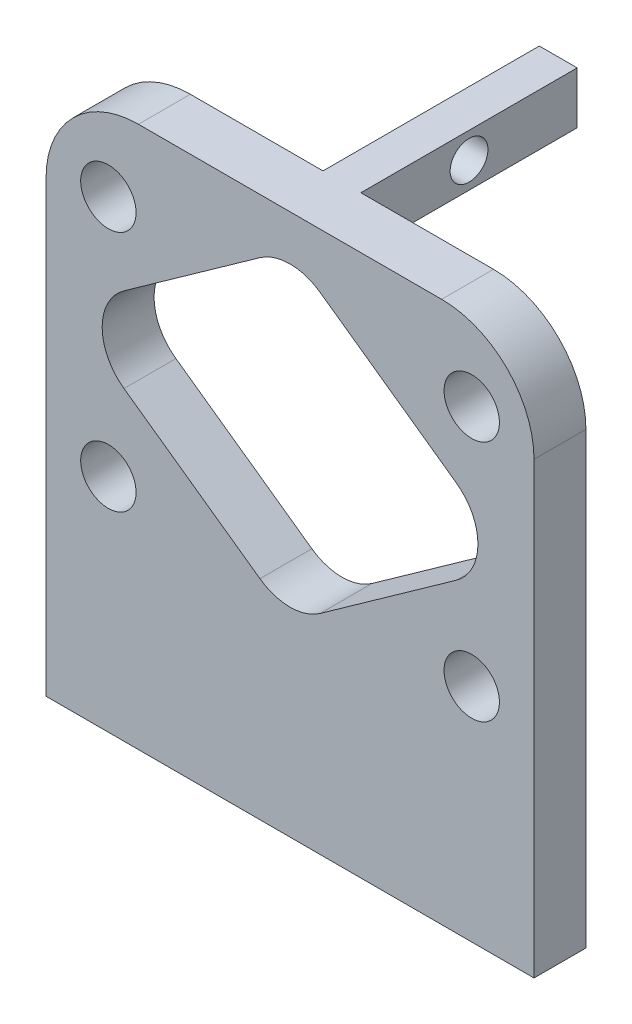
ISO-10303-21;
HEADER;
FILE_DESCRIPTION(('STEP AP214'),'2;1');
FILE_NAME('part.step','',(''),(''),'','','');
FILE_SCHEMA(('AUTOMOTIVE_DESIGN { 1 0 10303 214 1 1 1 1 }'));
ENDSEC;
DATA;
#1=APPLICATION_CONTEXT('core data for automotive mechanical design processes');
#2=APPLICATION_PROTOCOL_DEFINITION('international standard','automotive_design',2000,#1);
#3=PRODUCT_CONTEXT('',#1,'mechanical');
#4=PRODUCT('Part','Part','',(#3));
#5=PRODUCT_RELATED_PRODUCT_CATEGORY('part','',(#4));
#6=PRODUCT_DEFINITION_FORMATION('','',#4);
#7=PRODUCT_DEFINITION_CONTEXT('part definition',#1,'design');
#8=PRODUCT_DEFINITION('design','',#6,#7);
#9=PRODUCT_DEFINITION_SHAPE('','',#8);
#10=(LENGTH_UNIT() NAMED_UNIT(*) SI_UNIT(.MILLI.,.METRE.));
#11=(NAMED_UNIT(*) PLANE_ANGLE_UNIT() SI_UNIT($,.RADIAN.));
#12=(NAMED_UNIT(*) SI_UNIT($,.STERADIAN.) SOLID_ANGLE_UNIT());
#13=UNCERTAINTY_MEASURE_WITH_UNIT(LENGTH_MEASURE(1.E-05),#10,'distance_accuracy_value','');
#14=(GEOMETRIC_REPRESENTATION_CONTEXT(3) GLOBAL_UNCERTAINTY_ASSIGNED_CONTEXT((#13)) GLOBAL_UNIT_ASSIGNED_CONTEXT((#10,
#11,#12)) REPRESENTATION_CONTEXT('',''));
#15=CARTESIAN_POINT('',(0.,0.,0.));
#16=DIRECTION('',(0.,0.,1.));
#17=DIRECTION('',(1.,0.,0.));
#18=AXIS2_PLACEMENT_3D('',#15,#16,#17);
#19=CARTESIAN_POINT('',(14.9160662909024,29.9521916334879,3.));
#20=DIRECTION('',(0.,0.,-1.));
#21=DIRECTION('',(-1.,0.,0.));
#22=AXIS2_PLACEMENT_3D('',#19,#20,#21);
#23=PLANE('',#22);
#24=CARTESIAN_POINT('',(34.1768293529617,30.7930162356204,3.));
#25=DIRECTION('',(0.,0.,1.));
#26=DIRECTION('',(1.,0.,0.));
#27=AXIS2_PLACEMENT_3D('',#24,#25,#26);
#28=CIRCLE('',#27,1.6);
#29=CARTESIAN_POINT('',(35.7768293529617,30.7930162356204,3.));
#30=VERTEX_POINT('',#29);
#31=EDGE_CURVE('E284',#30,#30,#28,.T.);
#32=ORIENTED_EDGE('',*,*,#31,.F.);
#33=EDGE_LOOP('',(#32));
#34=FACE_BOUND('',#33,.T.);
#35=CARTESIAN_POINT('',(13.1768293529617,16.7930162356204,3.));
#36=DIRECTION('',(0.,0.,1.));
#37=DIRECTION('',(1.,0.,0.));
#38=AXIS2_PLACEMENT_3D('',#35,#36,#37);
#39=CIRCLE('',#38,1.6);
#40=CARTESIAN_POINT('',(14.7768293529617,16.7930162356204,3.));
#41=VERTEX_POINT('',#40);
#42=EDGE_CURVE('E291',#41,#41,#39,.T.);
#43=ORIENTED_EDGE('',*,*,#42,.F.);
#44=EDGE_LOOP('',(#43));
#45=FACE_BOUND('',#44,.T.);
#46=CARTESIAN_POINT('',(34.1768293529617,16.7930162356204,3.));
#47=DIRECTION('',(0.,0.,1.));
#48=DIRECTION('',(1.,0.,0.));
#49=AXIS2_PLACEMENT_3D('',#46,#47,#48);
#50=CIRCLE('',#49,1.6);
#51=CARTESIAN_POINT('',(35.7768293529617,16.7930162356204,3.));
#52=VERTEX_POINT('',#51);
#53=EDGE_CURVE('E278',#52,#52,#50,.T.);
#54=ORIENTED_EDGE('',*,*,#53,.F.);
#55=EDGE_LOOP('',(#54));
#56=FACE_BOUND('',#55,.T.);
#57=CARTESIAN_POINT('',(13.1768293529617,30.7930162356204,3.));
#58=DIRECTION('',(0.,0.,1.));
#59=DIRECTION('',(1.,0.,0.));
#60=AXIS2_PLACEMENT_3D('',#57,#58,#59);
#61=CIRCLE('',#60,1.6);
#62=CARTESIAN_POINT('',(14.7768293529617,30.7930162356204,3.));
#63=VERTEX_POINT('',#62);
#64=EDGE_CURVE('E287',#63,#63,#61,.T.);
#65=ORIENTED_EDGE('',*,*,#64,.F.);
#66=EDGE_LOOP('',(#65));
#67=FACE_BOUND('',#66,.T.);
#68=DIRECTION('',(0.,-1.,0.));
#69=VECTOR('',#68,1.);
#70=CARTESIAN_POINT('',(9.57682935296174,12.8914285714286,3.));
#71=LINE('',#70,#69);
#72=CARTESIAN_POINT('',(9.57682935296174,29.9521916334879,3.));
#73=VERTEX_POINT('',#72);
#74=CARTESIAN_POINT('',(9.57682935296175,3.99142857142858,3.));
#75=VERTEX_POINT('',#74);
#76=EDGE_CURVE('E364',#73,#75,#71,.T.);
#77=ORIENTED_EDGE('',*,*,#76,.T.);
#78=DIRECTION('',(-1.,0.,0.));
#79=VECTOR('',#78,1.);
#80=CARTESIAN_POINT('',(37.7768293529617,3.99142857142858,3.));
#81=LINE('',#80,#79);
#82=CARTESIAN_POINT('',(37.7768293529617,3.99142857142858,3.));
#83=VERTEX_POINT('',#82);
#84=EDGE_CURVE('E231',#83,#75,#81,.T.);
#85=ORIENTED_EDGE('',*,*,#84,.F.);
#86=DIRECTION('',(0.,1.,0.));
#87=VECTOR('',#86,1.);
#88=CARTESIAN_POINT('',(37.7768293529617,12.8914285714286,3.));
#89=LINE('',#88,#87);
#90=CARTESIAN_POINT('',(37.7768293529617,29.9521916334879,3.));
#91=VERTEX_POINT('',#90);
#92=EDGE_CURVE('E366',#83,#91,#89,.T.);
#93=ORIENTED_EDGE('',*,*,#92,.T.);
#94=CARTESIAN_POINT('',(32.4375924150211,29.9521916334879,3.));
#95=DIRECTION('',(0.,0.,1.));
#96=DIRECTION('',(-1.,0.,0.));
#97=AXIS2_PLACEMENT_3D('',#94,#95,#96);
#98=CIRCLE('',#97,5.33923693794064);
#99=CARTESIAN_POINT('',(32.4375924150211,35.2914285714286,3.));
#100=VERTEX_POINT('',#99);
#101=EDGE_CURVE('E369',#91,#100,#98,.T.);
#102=ORIENTED_EDGE('',*,*,#101,.T.);
#103=DIRECTION('',(-1.,0.,0.));
#104=VECTOR('',#103,1.);
#105=CARTESIAN_POINT('',(14.9160662909024,35.2914285714286,3.));
#106=LINE('',#105,#104);
#107=CARTESIAN_POINT('',(14.9160662909024,35.2914285714286,3.));
#108=VERTEX_POINT('',#107);
#109=EDGE_CURVE('E371',#100,#108,#106,.T.);
#110=ORIENTED_EDGE('',*,*,#109,.T.);
#111=CARTESIAN_POINT('',(14.9160662909024,29.9521916334879,3.));
#112=DIRECTION('',(0.,0.,1.));
#113=DIRECTION('',(-1.,0.,0.));
#114=AXIS2_PLACEMENT_3D('',#111,#112,#113);
#115=CIRCLE('',#114,5.33923693794064);
#116=EDGE_CURVE('E373',#108,#73,#115,.T.);
#117=ORIENTED_EDGE('',*,*,#116,.T.);
#118=EDGE_LOOP('',(#77,#85,#93,#102,#110,#117));
#119=FACE_BOUND('',#118,.T.);
#120=CARTESIAN_POINT('',(23.6768293529618,18.5023904015677,3.));
#121=DIRECTION('',(0.,0.,1.));
#122=DIRECTION('',(1.,0.,0.));
#123=AXIS2_PLACEMENT_3D('',#120,#121,#122);
#124=CIRCLE('',#123,3.);
#125=CARTESIAN_POINT('',(21.938160435116,16.0575938059145,3.));
#126=VERTEX_POINT('',#125);
#127=CARTESIAN_POINT('',(25.4154982708075,16.0575938059145,3.));
#128=VERTEX_POINT('',#127);
#129=EDGE_CURVE('E302',#126,#128,#124,.T.);
#130=ORIENTED_EDGE('',*,*,#129,.F.);
#131=DIRECTION('',(0.814932198551049,-0.579556305948571,0.));
#132=VECTOR('',#131,1.);
#133=CARTESIAN_POINT('',(14.0792395385592,21.6466319757754,3.));
#134=LINE('',#133,#132);
#135=CARTESIAN_POINT('',(14.0792395385592,21.6466319757754,3.));
#136=VERTEX_POINT('',#135);
#137=EDGE_CURVE('E318',#136,#126,#134,.T.);
#138=ORIENTED_EDGE('',*,*,#137,.F.);
#139=CARTESIAN_POINT('',(15.8179084564049,24.0914285714286,3.));
#140=DIRECTION('',(0.,0.,1.));
#141=DIRECTION('',(1.,0.,0.));
#142=AXIS2_PLACEMENT_3D('',#139,#140,#141);
#143=CIRCLE('',#142,3.);
#144=CARTESIAN_POINT('',(14.0792395385592,26.5362251670817,3.));
#145=VERTEX_POINT('',#144);
#146=EDGE_CURVE('E315',#145,#136,#143,.T.);
#147=ORIENTED_EDGE('',*,*,#146,.F.);
#148=DIRECTION('',(-0.814932198551049,-0.579556305948571,0.));
#149=VECTOR('',#148,1.);
#150=CARTESIAN_POINT('',(14.0792395385592,26.5362251670817,3.));
#151=LINE('',#150,#149);
#152=CARTESIAN_POINT('',(21.938160435116,32.1252633369427,3.));
#153=VERTEX_POINT('',#152);
#154=EDGE_CURVE('E313',#153,#145,#151,.T.);
#155=ORIENTED_EDGE('',*,*,#154,.F.);
#156=CARTESIAN_POINT('',(23.6768293529618,29.6804667412895,3.));
#157=DIRECTION('',(0.,0.,1.));
#158=DIRECTION('',(-1.,0.,0.));
#159=AXIS2_PLACEMENT_3D('',#156,#157,#158);
#160=CIRCLE('',#159,3.00000000000001);
#161=CARTESIAN_POINT('',(25.4154982708075,32.1252633369427,3.));
#162=VERTEX_POINT('',#161);
#163=EDGE_CURVE('E311',#162,#153,#160,.T.);
#164=ORIENTED_EDGE('',*,*,#163,.F.);
#165=DIRECTION('',(-0.814932198551049,0.579556305948571,0.));
#166=VECTOR('',#165,1.);
#167=CARTESIAN_POINT('',(25.4154982708075,32.1252633369427,3.));
#168=LINE('',#167,#166);
#169=CARTESIAN_POINT('',(33.2744191673643,26.5362251670817,3.));
#170=VERTEX_POINT('',#169);
#171=EDGE_CURVE('E309',#170,#162,#168,.T.);
#172=ORIENTED_EDGE('',*,*,#171,.F.);
#173=CARTESIAN_POINT('',(31.5357502495186,24.0914285714286,3.));
#174=DIRECTION('',(0.,0.,1.));
#175=DIRECTION('',(1.,0.,0.));
#176=AXIS2_PLACEMENT_3D('',#173,#174,#175);
#177=CIRCLE('',#176,3.);
#178=CARTESIAN_POINT('',(33.2744191673643,21.6466319757754,3.));
#179=VERTEX_POINT('',#178);
#180=EDGE_CURVE('E307',#179,#170,#177,.T.);
#181=ORIENTED_EDGE('',*,*,#180,.F.);
#182=DIRECTION('',(0.814932198551049,0.579556305948571,0.));
#183=VECTOR('',#182,1.);
#184=CARTESIAN_POINT('',(25.4154982708075,16.0575938059145,3.));
#185=LINE('',#184,#183);
#186=EDGE_CURVE('E304',#128,#179,#185,.T.);
#187=ORIENTED_EDGE('',*,*,#186,.F.);
#188=EDGE_LOOP('',(#130,#138,#147,#155,#164,#172,#181,#187));
#189=FACE_BOUND('',#188,.T.);
#190=ADVANCED_FACE('F41',(#34,#45,#56,#67,#119,#189),#23,.F.);
#191=CARTESIAN_POINT('',(14.9160662909024,29.9521916334879,0.));
#192=DIRECTION('',(0.,0.,-1.));
#193=DIRECTION('',(-1.,0.,0.));
#194=AXIS2_PLACEMENT_3D('',#191,#192,#193);
#195=PLANE('',#194);
#196=DIRECTION('',(0.,-1.,0.));
#197=VECTOR('',#196,1.);
#198=CARTESIAN_POINT('',(24.7712024696485,6.99142857142858,0.));
#199=LINE('',#198,#197);
#200=CARTESIAN_POINT('',(24.7712024696485,6.99142857142858,0.));
#201=VERTEX_POINT('',#200);
#202=CARTESIAN_POINT('',(24.7712024696485,3.99142857142858,0.));
#203=VERTEX_POINT('',#202);
#204=EDGE_CURVE('E58',#201,#203,#199,.T.);
#205=ORIENTED_EDGE('',*,*,#204,.F.);
#206=DIRECTION('',(1.,0.,0.));
#207=VECTOR('',#206,1.);
#208=CARTESIAN_POINT('',(9.72749610409256,6.99142857142858,0.));
#209=LINE('',#208,#207);
#210=CARTESIAN_POINT('',(22.582456236275,6.99142857142858,0.));
#211=VERTEX_POINT('',#210);
#212=EDGE_CURVE('E224',#211,#201,#209,.T.);
#213=ORIENTED_EDGE('',*,*,#212,.F.);
#214=DIRECTION('',(0.,1.,0.));
#215=VECTOR('',#214,1.);
#216=CARTESIAN_POINT('',(22.582456236275,6.99142857142858,0.));
#217=LINE('',#216,#215);
#218=CARTESIAN_POINT('',(22.582456236275,3.99142857142858,0.));
#219=VERTEX_POINT('',#218);
#220=EDGE_CURVE('E505',#219,#211,#217,.T.);
#221=ORIENTED_EDGE('',*,*,#220,.F.);
#222=DIRECTION('',(1.,0.,0.));
#223=VECTOR('',#222,1.);
#224=CARTESIAN_POINT('',(9.57682935296174,3.99142857142858,0.));
#225=LINE('',#224,#223);
#226=CARTESIAN_POINT('',(9.57682935296174,3.99142857142858,0.));
#227=VERTEX_POINT('',#226);
#228=EDGE_CURVE('E236',#227,#219,#225,.T.);
#229=ORIENTED_EDGE('',*,*,#228,.F.);
#230=DIRECTION('',(0.,-1.,0.));
#231=VECTOR('',#230,1.);
#232=CARTESIAN_POINT('',(9.57682935296174,12.8914285714286,0.));
#233=LINE('',#232,#231);
#234=CARTESIAN_POINT('',(9.57682935296174,29.9521916334879,0.));
#235=VERTEX_POINT('',#234);
#236=EDGE_CURVE('E363',#235,#227,#233,.T.);
#237=ORIENTED_EDGE('',*,*,#236,.F.);
#238=CARTESIAN_POINT('',(14.9160662909024,29.9521916334879,0.));
#239=DIRECTION('',(0.,0.,1.));
#240=DIRECTION('',(-1.,0.,0.));
#241=AXIS2_PLACEMENT_3D('',#238,#239,#240);
#242=CIRCLE('',#241,5.33923693794064);
#243=CARTESIAN_POINT('',(14.9160662909024,35.2914285714286,0.));
#244=VERTEX_POINT('',#243);
#245=EDGE_CURVE('E367',#244,#235,#242,.T.);
#246=ORIENTED_EDGE('',*,*,#245,.F.);
#247=DIRECTION('',(-1.,0.,0.));
#248=VECTOR('',#247,1.);
#249=CARTESIAN_POINT('',(14.9160662909024,35.2914285714286,0.));
#250=LINE('',#249,#248);
#251=CARTESIAN_POINT('',(22.582456236275,35.2914285714286,0.));
#252=VERTEX_POINT('',#251);
#253=EDGE_CURVE('E381',#252,#244,#250,.T.);
#254=ORIENTED_EDGE('',*,*,#253,.F.);
#255=DIRECTION('',(0.,1.,0.));
#256=VECTOR('',#255,1.);
#257=CARTESIAN_POINT('',(22.582456236275,32.2914285714286,0.));
#258=LINE('',#257,#256);
#259=CARTESIAN_POINT('',(22.582456236275,32.4737349850272,0.));
#260=VERTEX_POINT('',#259);
#261=EDGE_CURVE('E11',#260,#252,#258,.T.);
#262=ORIENTED_EDGE('',*,*,#261,.F.);
#263=CARTESIAN_POINT('',(23.6768293529618,29.6804667412895,0.));
#264=DIRECTION('',(0.,0.,1.));
#265=DIRECTION('',(-1.,0.,0.));
#266=AXIS2_PLACEMENT_3D('',#263,#264,#265);
#267=CIRCLE('',#266,3.00000000000001);
#268=CARTESIAN_POINT('',(21.938160435116,32.1252633369427,0.));
#269=VERTEX_POINT('',#268);
#270=EDGE_CURVE('E332',#260,#269,#267,.T.);
#271=ORIENTED_EDGE('',*,*,#270,.T.);
#272=DIRECTION('',(-0.814932198551049,-0.579556305948571,0.));
#273=VECTOR('',#272,1.);
#274=CARTESIAN_POINT('',(14.0792395385592,26.5362251670817,0.));
#275=LINE('',#274,#273);
#276=CARTESIAN_POINT('',(14.0792395385592,26.5362251670817,0.));
#277=VERTEX_POINT('',#276);
#278=EDGE_CURVE('E336',#269,#277,#275,.T.);
#279=ORIENTED_EDGE('',*,*,#278,.T.);
#280=CARTESIAN_POINT('',(15.8179084564049,24.0914285714286,0.));
#281=DIRECTION('',(0.,0.,1.));
#282=DIRECTION('',(1.,0.,0.));
#283=AXIS2_PLACEMENT_3D('',#280,#281,#282);
#284=CIRCLE('',#283,3.);
#285=CARTESIAN_POINT('',(14.0792395385592,21.6466319757754,0.));
#286=VERTEX_POINT('',#285);
#287=EDGE_CURVE('E340',#277,#286,#284,.T.);
#288=ORIENTED_EDGE('',*,*,#287,.T.);
#289=DIRECTION('',(0.814932198551049,-0.579556305948571,0.));
#290=VECTOR('',#289,1.);
#291=CARTESIAN_POINT('',(14.0792395385592,21.6466319757754,0.));
#292=LINE('',#291,#290);
#293=CARTESIAN_POINT('',(21.938160435116,16.0575938059145,0.));
#294=VERTEX_POINT('',#293);
#295=EDGE_CURVE('E305',#286,#294,#292,.T.);
#296=ORIENTED_EDGE('',*,*,#295,.T.);
#297=CARTESIAN_POINT('',(23.6768293529618,18.5023904015677,0.));
#298=DIRECTION('',(0.,0.,1.));
#299=DIRECTION('',(1.,0.,0.));
#300=AXIS2_PLACEMENT_3D('',#297,#298,#299);
#301=CIRCLE('',#300,3.);
#302=CARTESIAN_POINT('',(25.4154982708075,16.0575938059145,0.));
#303=VERTEX_POINT('',#302);
#304=EDGE_CURVE('E299',#294,#303,#301,.T.);
#305=ORIENTED_EDGE('',*,*,#304,.T.);
#306=DIRECTION('',(0.814932198551049,0.579556305948571,0.));
#307=VECTOR('',#306,1.);
#308=CARTESIAN_POINT('',(25.4154982708075,16.0575938059145,0.));
#309=LINE('',#308,#307);
#310=CARTESIAN_POINT('',(33.2744191673643,21.6466319757754,0.));
#311=VERTEX_POINT('',#310);
#312=EDGE_CURVE('E323',#303,#311,#309,.T.);
#313=ORIENTED_EDGE('',*,*,#312,.T.);
#314=CARTESIAN_POINT('',(31.5357502495186,24.0914285714286,0.));
#315=DIRECTION('',(0.,0.,1.));
#316=DIRECTION('',(1.,0.,0.));
#317=AXIS2_PLACEMENT_3D('',#314,#315,#316);
#318=CIRCLE('',#317,3.);
#319=CARTESIAN_POINT('',(33.2744191673643,26.5362251670817,0.));
#320=VERTEX_POINT('',#319);
#321=EDGE_CURVE('E326',#311,#320,#318,.T.);
#322=ORIENTED_EDGE('',*,*,#321,.T.);
#323=DIRECTION('',(-0.814932198551049,0.579556305948571,0.));
#324=VECTOR('',#323,1.);
#325=CARTESIAN_POINT('',(25.4154982708075,32.1252633369427,0.));
#326=LINE('',#325,#324);
#327=CARTESIAN_POINT('',(25.4154982708075,32.1252633369427,0.));
#328=VERTEX_POINT('',#327);
#329=EDGE_CURVE('E329',#320,#328,#326,.T.);
#330=ORIENTED_EDGE('',*,*,#329,.T.);
#331=CARTESIAN_POINT('',(24.7712024696485,32.4737349850272,0.));
#332=VERTEX_POINT('',#331);
#333=EDGE_CURVE('E333',#328,#332,#267,.T.);
#334=ORIENTED_EDGE('',*,*,#333,.T.);
#335=DIRECTION('',(0.,-1.,0.));
#336=VECTOR('',#335,1.);
#337=CARTESIAN_POINT('',(24.7712024696485,32.2914285714286,0.));
#338=LINE('',#337,#336);
#339=CARTESIAN_POINT('',(24.7712024696485,35.2914285714286,0.));
#340=VERTEX_POINT('',#339);
#341=EDGE_CURVE('E253',#340,#332,#338,.T.);
#342=ORIENTED_EDGE('',*,*,#341,.F.);
#343=CARTESIAN_POINT('',(32.4375924150211,35.2914285714286,0.));
#344=VERTEX_POINT('',#343);
#345=EDGE_CURVE('E382',#344,#340,#250,.T.);
#346=ORIENTED_EDGE('',*,*,#345,.F.);
#347=CARTESIAN_POINT('',(32.4375924150211,29.9521916334879,0.));
#348=DIRECTION('',(0.,0.,1.));
#349=DIRECTION('',(-1.,0.,0.));
#350=AXIS2_PLACEMENT_3D('',#347,#348,#349);
#351=CIRCLE('',#350,5.33923693794064);
#352=CARTESIAN_POINT('',(37.7768293529617,29.9521916334879,0.));
#353=VERTEX_POINT('',#352);
#354=EDGE_CURVE('E379',#353,#344,#351,.T.);
#355=ORIENTED_EDGE('',*,*,#354,.F.);
#356=DIRECTION('',(0.,1.,0.));
#357=VECTOR('',#356,1.);
#358=CARTESIAN_POINT('',(37.7768293529617,12.8914285714286,0.));
#359=LINE('',#358,#357);
#360=CARTESIAN_POINT('',(37.7768293529617,3.99142857142858,0.));
#361=VERTEX_POINT('',#360);
#362=EDGE_CURVE('E377',#361,#353,#359,.T.);
#363=ORIENTED_EDGE('',*,*,#362,.F.);
#364=EDGE_CURVE('E238',#203,#361,#225,.T.);
#365=ORIENTED_EDGE('',*,*,#364,.F.);
#366=EDGE_LOOP('',(#205,#213,#221,#229,#237,#246,#254,#262,#271,#279,#288,#296,#305,#313,#322,
#330,#334,#342,#346,#355,#363,#365));
#367=FACE_BOUND('',#366,.T.);
#368=CARTESIAN_POINT('',(34.1768293529617,30.7930162356204,0.));
#369=DIRECTION('',(0.,0.,1.));
#370=DIRECTION('',(1.,0.,0.));
#371=AXIS2_PLACEMENT_3D('',#368,#369,#370);
#372=CIRCLE('',#371,1.6);
#373=CARTESIAN_POINT('',(35.7768293529617,30.7930162356204,0.));
#374=VERTEX_POINT('',#373);
#375=EDGE_CURVE('E288',#374,#374,#372,.T.);
#376=ORIENTED_EDGE('',*,*,#375,.T.);
#377=EDGE_LOOP('',(#376));
#378=FACE_BOUND('',#377,.T.);
#379=CARTESIAN_POINT('',(13.1768293529617,16.7930162356204,0.));
#380=DIRECTION('',(0.,0.,1.));
#381=DIRECTION('',(1.,0.,0.));
#382=AXIS2_PLACEMENT_3D('',#379,#380,#381);
#383=CIRCLE('',#382,1.6);
#384=CARTESIAN_POINT('',(14.7768293529617,16.7930162356204,0.));
#385=VERTEX_POINT('',#384);
#386=EDGE_CURVE('E281',#385,#385,#383,.T.);
#387=ORIENTED_EDGE('',*,*,#386,.T.);
#388=EDGE_LOOP('',(#387));
#389=FACE_BOUND('',#388,.T.);
#390=CARTESIAN_POINT('',(34.1768293529617,16.7930162356204,0.));
#391=DIRECTION('',(0.,0.,1.));
#392=DIRECTION('',(1.,0.,0.));
#393=AXIS2_PLACEMENT_3D('',#390,#391,#392);
#394=CIRCLE('',#393,1.6);
#395=CARTESIAN_POINT('',(35.7768293529617,16.7930162356204,0.));
#396=VERTEX_POINT('',#395);
#397=EDGE_CURVE('E277',#396,#396,#394,.T.);
#398=ORIENTED_EDGE('',*,*,#397,.T.);
#399=EDGE_LOOP('',(#398));
#400=FACE_BOUND('',#399,.T.);
#401=CARTESIAN_POINT('',(13.1768293529617,30.7930162356204,0.));
#402=DIRECTION('',(0.,0.,1.));
#403=DIRECTION('',(1.,0.,0.));
#404=AXIS2_PLACEMENT_3D('',#401,#402,#403);
#405=CIRCLE('',#404,1.6);
#406=CARTESIAN_POINT('',(14.7768293529617,30.7930162356204,0.));
#407=VERTEX_POINT('',#406);
#408=EDGE_CURVE('E296',#407,#407,#405,.T.);
#409=ORIENTED_EDGE('',*,*,#408,.T.);
#410=EDGE_LOOP('',(#409));
#411=FACE_BOUND('',#410,.T.);
#412=ADVANCED_FACE('F404',(#367,#378,#389,#400,#411),#195,.T.);
#413=CARTESIAN_POINT('',(9.57682935296174,12.8914285714286,3.));
#414=DIRECTION('',(1.,0.,0.));
#415=DIRECTION('',(0.,1.,0.));
#416=AXIS2_PLACEMENT_3D('',#413,#414,#415);
#417=PLANE('',#416);
#418=ORIENTED_EDGE('',*,*,#236,.T.);
#419=DIRECTION('',(0.,0.,-1.));
#420=VECTOR('',#419,1.);
#421=CARTESIAN_POINT('',(9.57682935296174,3.99142857142858,3.));
#422=LINE('',#421,#420);
#423=EDGE_CURVE('E239',#75,#227,#422,.T.);
#424=ORIENTED_EDGE('',*,*,#423,.F.);
#425=ORIENTED_EDGE('',*,*,#76,.F.);
#426=DIRECTION('',(0.,0.,-1.));
#427=VECTOR('',#426,1.);
#428=CARTESIAN_POINT('',(9.57682935296174,29.9521916334879,3.));
#429=LINE('',#428,#427);
#430=EDGE_CURVE('E375',#73,#235,#429,.T.);
#431=ORIENTED_EDGE('',*,*,#430,.T.);
#432=EDGE_LOOP('',(#418,#424,#425,#431));
#433=FACE_BOUND('',#432,.T.);
#434=ADVANCED_FACE('F43',(#433),#417,.F.);
#435=CARTESIAN_POINT('',(37.7768293529617,12.8914285714286,3.));
#436=DIRECTION('',(-1.,0.,0.));
#437=DIRECTION('',(0.,0.,1.));
#438=AXIS2_PLACEMENT_3D('',#435,#436,#437);
#439=PLANE('',#438);
#440=ORIENTED_EDGE('',*,*,#362,.T.);
#441=DIRECTION('',(0.,0.,-1.));
#442=VECTOR('',#441,1.);
#443=CARTESIAN_POINT('',(37.7768293529617,29.9521916334879,3.));
#444=LINE('',#443,#442);
#445=EDGE_CURVE('E45',#91,#353,#444,.T.);
#446=ORIENTED_EDGE('',*,*,#445,.F.);
#447=ORIENTED_EDGE('',*,*,#92,.F.);
#448=DIRECTION('',(0.,0.,1.));
#449=VECTOR('',#448,1.);
#450=CARTESIAN_POINT('',(37.7768293529617,3.99142857142858,0.));
#451=LINE('',#450,#449);
#452=EDGE_CURVE('E232',#361,#83,#451,.T.);
#453=ORIENTED_EDGE('',*,*,#452,.F.);
#454=EDGE_LOOP('',(#440,#446,#447,#453));
#455=FACE_BOUND('',#454,.T.);
#456=ADVANCED_FACE('F494',(#455),#439,.F.);
#457=CARTESIAN_POINT('',(32.4375924150211,29.9521916334879,3.));
#458=DIRECTION('',(0.,0.,-1.));
#459=DIRECTION('',(-1.,0.,0.));
#460=AXIS2_PLACEMENT_3D('',#457,#458,#459);
#461=CYLINDRICAL_SURFACE('',#460,5.33923693794064);
#462=ORIENTED_EDGE('',*,*,#354,.T.);
#463=DIRECTION('',(0.,0.,-1.));
#464=VECTOR('',#463,1.);
#465=CARTESIAN_POINT('',(32.4375924150211,35.2914285714286,3.));
#466=LINE('',#465,#464);
#467=EDGE_CURVE('E390',#100,#344,#466,.T.);
#468=ORIENTED_EDGE('',*,*,#467,.F.);
#469=ORIENTED_EDGE('',*,*,#101,.F.);
#470=ORIENTED_EDGE('',*,*,#445,.T.);
#471=EDGE_LOOP('',(#462,#468,#469,#470));
#472=FACE_BOUND('',#471,.T.);
#473=ADVANCED_FACE('F401',(#472),#461,.T.);
#474=CARTESIAN_POINT('',(14.9160662909024,35.2914285714286,3.));
#475=DIRECTION('',(0.,-1.,0.));
#476=DIRECTION('',(0.,0.,-1.));
#477=AXIS2_PLACEMENT_3D('',#474,#475,#476);
#478=PLANE('',#477);
#479=ORIENTED_EDGE('',*,*,#345,.T.);
#480=DIRECTION('',(0.,0.,1.));
#481=VECTOR('',#480,1.);
#482=CARTESIAN_POINT('',(24.7712024696485,35.2914285714286,-12.5));
#483=LINE('',#482,#481);
#484=CARTESIAN_POINT('',(24.7712024696485,35.2914285714286,-12.5));
#485=VERTEX_POINT('',#484);
#486=EDGE_CURVE('E268',#485,#340,#483,.T.);
#487=ORIENTED_EDGE('',*,*,#486,.F.);
#488=DIRECTION('',(1.,0.,0.));
#489=VECTOR('',#488,1.);
#490=CARTESIAN_POINT('',(24.7712024696485,35.2914285714286,-12.5));
#491=LINE('',#490,#489);
#492=CARTESIAN_POINT('',(22.582456236275,35.2914285714286,-12.5));
#493=VERTEX_POINT('',#492);
#494=EDGE_CURVE('E255',#493,#485,#491,.T.);
#495=ORIENTED_EDGE('',*,*,#494,.F.);
#496=DIRECTION('',(0.,0.,1.));
#497=VECTOR('',#496,1.);
#498=CARTESIAN_POINT('',(22.582456236275,35.2914285714286,-12.5));
#499=LINE('',#498,#497);
#500=EDGE_CURVE('E271',#493,#252,#499,.T.);
#501=ORIENTED_EDGE('',*,*,#500,.T.);
#502=ORIENTED_EDGE('',*,*,#253,.T.);
#503=DIRECTION('',(0.,0.,-1.));
#504=VECTOR('',#503,1.);
#505=CARTESIAN_POINT('',(14.9160662909024,35.2914285714286,3.));
#506=LINE('',#505,#504);
#507=EDGE_CURVE('E388',#108,#244,#506,.T.);
#508=ORIENTED_EDGE('',*,*,#507,.F.);
#509=ORIENTED_EDGE('',*,*,#109,.F.);
#510=ORIENTED_EDGE('',*,*,#467,.T.);
#511=EDGE_LOOP('',(#479,#487,#495,#501,#502,#508,#509,#510));
#512=FACE_BOUND('',#511,.T.);
#513=ADVANCED_FACE('F408',(#512),#478,.F.);
#514=CARTESIAN_POINT('',(14.9160662909024,29.9521916334879,3.));
#515=DIRECTION('',(0.,0.,-1.));
#516=DIRECTION('',(-1.,0.,0.));
#517=AXIS2_PLACEMENT_3D('',#514,#515,#516);
#518=CYLINDRICAL_SURFACE('',#517,5.33923693794064);
#519=ORIENTED_EDGE('',*,*,#245,.T.);
#520=ORIENTED_EDGE('',*,*,#430,.F.);
#521=ORIENTED_EDGE('',*,*,#116,.F.);
#522=ORIENTED_EDGE('',*,*,#507,.T.);
#523=EDGE_LOOP('',(#519,#520,#521,#522));
#524=FACE_BOUND('',#523,.T.);
#525=ADVANCED_FACE('F487',(#524),#518,.T.);
#526=CARTESIAN_POINT('',(23.6768293529618,18.5023904015677,3.));
#527=DIRECTION('',(0.,0.,-1.));
#528=DIRECTION('',(-1.,0.,0.));
#529=AXIS2_PLACEMENT_3D('',#526,#527,#528);
#530=CYLINDRICAL_SURFACE('',#529,3.);
#531=ORIENTED_EDGE('',*,*,#304,.F.);
#532=DIRECTION('',(0.,0.,-1.));
#533=VECTOR('',#532,1.);
#534=CARTESIAN_POINT('',(21.938160435116,16.0575938059145,3.));
#535=LINE('',#534,#533);
#536=EDGE_CURVE('E320',#126,#294,#535,.T.);
#537=ORIENTED_EDGE('',*,*,#536,.F.);
#538=ORIENTED_EDGE('',*,*,#129,.T.);
#539=DIRECTION('',(0.,0.,-1.));
#540=VECTOR('',#539,1.);
#541=CARTESIAN_POINT('',(25.4154982708075,16.0575938059145,3.));
#542=LINE('',#541,#540);
#543=EDGE_CURVE('E360',#128,#303,#542,.T.);
#544=ORIENTED_EDGE('',*,*,#543,.T.);
#545=EDGE_LOOP('',(#531,#537,#538,#544));
#546=FACE_BOUND('',#545,.T.);
#547=ADVANCED_FACE('F449',(#546),#530,.F.);
#548=CARTESIAN_POINT('',(25.4154982708075,16.0575938059145,3.));
#549=DIRECTION('',(-0.579556305948571,0.814932198551049,0.));
#550=DIRECTION('',(-0.814932198551049,-0.579556305948571,0.));
#551=AXIS2_PLACEMENT_3D('',#548,#549,#550);
#552=PLANE('',#551);
#553=ORIENTED_EDGE('',*,*,#312,.F.);
#554=ORIENTED_EDGE('',*,*,#543,.F.);
#555=ORIENTED_EDGE('',*,*,#186,.T.);
#556=DIRECTION('',(0.,0.,-1.));
#557=VECTOR('',#556,1.);
#558=CARTESIAN_POINT('',(33.2744191673643,21.6466319757754,3.));
#559=LINE('',#558,#557);
#560=EDGE_CURVE('E358',#179,#311,#559,.T.);
#561=ORIENTED_EDGE('',*,*,#560,.T.);
#562=EDGE_LOOP('',(#553,#554,#555,#561));
#563=FACE_BOUND('',#562,.T.);
#564=ADVANCED_FACE('F457',(#563),#552,.T.);
#565=CARTESIAN_POINT('',(31.5357502495186,24.0914285714286,3.));
#566=DIRECTION('',(0.,0.,-1.));
#567=DIRECTION('',(-1.,0.,0.));
#568=AXIS2_PLACEMENT_3D('',#565,#566,#567);
#569=CYLINDRICAL_SURFACE('',#568,3.);
#570=ORIENTED_EDGE('',*,*,#321,.F.);
#571=ORIENTED_EDGE('',*,*,#560,.F.);
#572=ORIENTED_EDGE('',*,*,#180,.T.);
#573=DIRECTION('',(0.,0.,-1.));
#574=VECTOR('',#573,1.);
#575=CARTESIAN_POINT('',(33.2744191673643,26.5362251670817,3.));
#576=LINE('',#575,#574);
#577=EDGE_CURVE('E356',#170,#320,#576,.T.);
#578=ORIENTED_EDGE('',*,*,#577,.T.);
#579=EDGE_LOOP('',(#570,#571,#572,#578));
#580=FACE_BOUND('',#579,.T.);
#581=ADVANCED_FACE('F460',(#580),#569,.F.);
#582=CARTESIAN_POINT('',(25.4154982708075,32.1252633369427,3.));
#583=DIRECTION('',(-0.57955630594857,-0.814932198551049,0.));
#584=DIRECTION('',(0.814932198551049,-0.579556305948571,0.));
#585=AXIS2_PLACEMENT_3D('',#582,#583,#584);
#586=PLANE('',#585);
#587=ORIENTED_EDGE('',*,*,#329,.F.);
#588=ORIENTED_EDGE('',*,*,#577,.F.);
#589=ORIENTED_EDGE('',*,*,#171,.T.);
#590=DIRECTION('',(0.,0.,-1.));
#591=VECTOR('',#590,1.);
#592=CARTESIAN_POINT('',(25.4154982708075,32.1252633369427,3.));
#593=LINE('',#592,#591);
#594=EDGE_CURVE('E354',#162,#328,#593,.T.);
#595=ORIENTED_EDGE('',*,*,#594,.T.);
#596=EDGE_LOOP('',(#587,#588,#589,#595));
#597=FACE_BOUND('',#596,.T.);
#598=ADVANCED_FACE('F464',(#597),#586,.T.);
#599=CARTESIAN_POINT('',(23.6768293529618,29.6804667412895,3.));
#600=DIRECTION('',(0.,0.,-1.));
#601=DIRECTION('',(-1.,0.,0.));
#602=AXIS2_PLACEMENT_3D('',#599,#600,#601);
#603=CYLINDRICAL_SURFACE('',#602,3.00000000000001);
#604=ORIENTED_EDGE('',*,*,#333,.F.);
#605=ORIENTED_EDGE('',*,*,#594,.F.);
#606=ORIENTED_EDGE('',*,*,#163,.T.);
#607=DIRECTION('',(0.,0.,-1.));
#608=VECTOR('',#607,1.);
#609=CARTESIAN_POINT('',(21.938160435116,32.1252633369427,3.));
#610=LINE('',#609,#608);
#611=EDGE_CURVE('E351',#153,#269,#610,.T.);
#612=ORIENTED_EDGE('',*,*,#611,.T.);
#613=ORIENTED_EDGE('',*,*,#270,.F.);
#614=EDGE_CURVE('E337',#332,#260,#267,.T.);
#615=ORIENTED_EDGE('',*,*,#614,.F.);
#616=EDGE_LOOP('',(#604,#605,#606,#612,#613,#615));
#617=FACE_BOUND('',#616,.T.);
#618=ADVANCED_FACE('F431',(#617),#603,.F.);
#619=CARTESIAN_POINT('',(14.0792395385592,26.5362251670817,3.));
#620=DIRECTION('',(0.579556305948571,-0.814932198551049,0.));
#621=DIRECTION('',(0.814932198551049,0.579556305948571,0.));
#622=AXIS2_PLACEMENT_3D('',#619,#620,#621);
#623=PLANE('',#622);
#624=ORIENTED_EDGE('',*,*,#278,.F.);
#625=ORIENTED_EDGE('',*,*,#611,.F.);
#626=ORIENTED_EDGE('',*,*,#154,.T.);
#627=DIRECTION('',(0.,0.,-1.));
#628=VECTOR('',#627,1.);
#629=CARTESIAN_POINT('',(14.0792395385592,26.5362251670817,3.));
#630=LINE('',#629,#628);
#631=EDGE_CURVE('E349',#145,#277,#630,.T.);
#632=ORIENTED_EDGE('',*,*,#631,.T.);
#633=EDGE_LOOP('',(#624,#625,#626,#632));
#634=FACE_BOUND('',#633,.T.);
#635=ADVANCED_FACE('F436',(#634),#623,.T.);
#636=CARTESIAN_POINT('',(15.8179084564049,24.0914285714286,3.));
#637=DIRECTION('',(0.,0.,-1.));
#638=DIRECTION('',(-1.,0.,0.));
#639=AXIS2_PLACEMENT_3D('',#636,#637,#638);
#640=CYLINDRICAL_SURFACE('',#639,3.);
#641=ORIENTED_EDGE('',*,*,#287,.F.);
#642=ORIENTED_EDGE('',*,*,#631,.F.);
#643=ORIENTED_EDGE('',*,*,#146,.T.);
#644=DIRECTION('',(0.,0.,-1.));
#645=VECTOR('',#644,1.);
#646=CARTESIAN_POINT('',(14.0792395385592,21.6466319757754,3.));
#647=LINE('',#646,#645);
#648=EDGE_CURVE('E347',#136,#286,#647,.T.);
#649=ORIENTED_EDGE('',*,*,#648,.T.);
#650=EDGE_LOOP('',(#641,#642,#643,#649));
#651=FACE_BOUND('',#650,.T.);
#652=ADVANCED_FACE('F441',(#651),#640,.F.);
#653=CARTESIAN_POINT('',(14.0792395385592,21.6466319757754,3.));
#654=DIRECTION('',(0.579556305948571,0.814932198551049,0.));
#655=DIRECTION('',(-0.814932198551049,0.579556305948571,0.));
#656=AXIS2_PLACEMENT_3D('',#653,#654,#655);
#657=PLANE('',#656);
#658=ORIENTED_EDGE('',*,*,#295,.F.);
#659=ORIENTED_EDGE('',*,*,#648,.F.);
#660=ORIENTED_EDGE('',*,*,#137,.T.);
#661=ORIENTED_EDGE('',*,*,#536,.T.);
#662=EDGE_LOOP('',(#658,#659,#660,#661));
#663=FACE_BOUND('',#662,.T.);
#664=ADVANCED_FACE('F444',(#663),#657,.T.);
#665=CARTESIAN_POINT('',(13.1768293529617,30.7930162356204,0.));
#666=DIRECTION('',(0.,0.,1.));
#667=DIRECTION('',(1.,0.,0.));
#668=AXIS2_PLACEMENT_3D('',#665,#666,#667);
#669=CYLINDRICAL_SURFACE('',#668,1.6);
#670=ORIENTED_EDGE('',*,*,#408,.F.);
#671=EDGE_LOOP('',(#670));
#672=FACE_BOUND('',#671,.T.);
#673=ORIENTED_EDGE('',*,*,#64,.T.);
#674=EDGE_LOOP('',(#673));
#675=FACE_BOUND('',#674,.T.);
#676=ADVANCED_FACE('F557',(#672,#675),#669,.F.);
#677=CARTESIAN_POINT('',(34.1768293529617,16.7930162356204,0.));
#678=DIRECTION('',(0.,0.,1.));
#679=DIRECTION('',(1.,0.,0.));
#680=AXIS2_PLACEMENT_3D('',#677,#678,#679);
#681=CYLINDRICAL_SURFACE('',#680,1.6);
#682=ORIENTED_EDGE('',*,*,#397,.F.);
#683=EDGE_LOOP('',(#682));
#684=FACE_BOUND('',#683,.T.);
#685=ORIENTED_EDGE('',*,*,#53,.T.);
#686=EDGE_LOOP('',(#685));
#687=FACE_BOUND('',#686,.T.);
#688=ADVANCED_FACE('F553',(#684,#687),#681,.F.);
#689=CARTESIAN_POINT('',(13.1768293529617,16.7930162356204,0.));
#690=DIRECTION('',(0.,0.,1.));
#691=DIRECTION('',(1.,0.,0.));
#692=AXIS2_PLACEMENT_3D('',#689,#690,#691);
#693=CYLINDRICAL_SURFACE('',#692,1.6);
#694=ORIENTED_EDGE('',*,*,#386,.F.);
#695=EDGE_LOOP('',(#694));
#696=FACE_BOUND('',#695,.T.);
#697=ORIENTED_EDGE('',*,*,#42,.T.);
#698=EDGE_LOOP('',(#697));
#699=FACE_BOUND('',#698,.T.);
#700=ADVANCED_FACE('F556',(#696,#699),#693,.F.);
#701=CARTESIAN_POINT('',(34.1768293529617,30.7930162356204,0.));
#702=DIRECTION('',(0.,0.,1.));
#703=DIRECTION('',(1.,0.,0.));
#704=AXIS2_PLACEMENT_3D('',#701,#702,#703);
#705=CYLINDRICAL_SURFACE('',#704,1.6);
#706=ORIENTED_EDGE('',*,*,#375,.F.);
#707=EDGE_LOOP('',(#706));
#708=FACE_BOUND('',#707,.T.);
#709=ORIENTED_EDGE('',*,*,#31,.T.);
#710=EDGE_LOOP('',(#709));
#711=FACE_BOUND('',#710,.T.);
#712=ADVANCED_FACE('F543',(#708,#711),#705,.F.);
#713=CARTESIAN_POINT('',(0.,0.,0.));
#714=DIRECTION('',(0.,0.,-1.));
#715=DIRECTION('',(-1.,0.,0.));
#716=AXIS2_PLACEMENT_3D('',#713,#714,#715);
#717=PLANE('',#716);
#718=CARTESIAN_POINT('',(24.7712024696485,32.2914285714286,0.));
#719=VERTEX_POINT('',#718);
#720=EDGE_CURVE('E263',#332,#719,#338,.T.);
#721=ORIENTED_EDGE('',*,*,#720,.F.);
#722=ORIENTED_EDGE('',*,*,#614,.T.);
#723=CARTESIAN_POINT('',(22.582456236275,32.2914285714286,0.));
#724=VERTEX_POINT('',#723);
#725=EDGE_CURVE('E51',#724,#260,#258,.T.);
#726=ORIENTED_EDGE('',*,*,#725,.F.);
#727=DIRECTION('',(-1.,0.,0.));
#728=VECTOR('',#727,1.);
#729=CARTESIAN_POINT('',(24.7712024696485,32.2914285714286,0.));
#730=LINE('',#729,#728);
#731=EDGE_CURVE('E248',#719,#724,#730,.T.);
#732=ORIENTED_EDGE('',*,*,#731,.F.);
#733=EDGE_LOOP('',(#721,#722,#726,#732));
#734=FACE_BOUND('',#733,.T.);
#735=ADVANCED_FACE('F426',(#734),#717,.F.);
#736=CARTESIAN_POINT('',(24.7712024696485,32.2914285714286,-12.5));
#737=DIRECTION('',(0.,1.,0.));
#738=DIRECTION('',(0.,0.,1.));
#739=AXIS2_PLACEMENT_3D('',#736,#737,#738);
#740=PLANE('',#739);
#741=ORIENTED_EDGE('',*,*,#731,.T.);
#742=DIRECTION('',(0.,0.,1.));
#743=VECTOR('',#742,1.);
#744=CARTESIAN_POINT('',(22.582456236275,32.2914285714286,-12.5));
#745=LINE('',#744,#743);
#746=CARTESIAN_POINT('',(22.582456236275,32.2914285714286,-12.5));
#747=VERTEX_POINT('',#746);
#748=EDGE_CURVE('E274',#747,#724,#745,.T.);
#749=ORIENTED_EDGE('',*,*,#748,.F.);
#750=DIRECTION('',(-1.,0.,0.));
#751=VECTOR('',#750,1.);
#752=CARTESIAN_POINT('',(24.7712024696485,32.2914285714286,-12.5));
#753=LINE('',#752,#751);
#754=CARTESIAN_POINT('',(24.7712024696485,32.2914285714286,-12.5));
#755=VERTEX_POINT('',#754);
#756=EDGE_CURVE('E249',#755,#747,#753,.T.);
#757=ORIENTED_EDGE('',*,*,#756,.F.);
#758=DIRECTION('',(0.,0.,1.));
#759=VECTOR('',#758,1.);
#760=CARTESIAN_POINT('',(24.7712024696485,32.2914285714286,-12.5));
#761=LINE('',#760,#759);
#762=EDGE_CURVE('E259',#755,#719,#761,.T.);
#763=ORIENTED_EDGE('',*,*,#762,.T.);
#764=EDGE_LOOP('',(#741,#749,#757,#763));
#765=FACE_BOUND('',#764,.T.);
#766=ADVANCED_FACE('F542',(#765),#740,.F.);
#767=CARTESIAN_POINT('',(22.582456236275,32.2914285714286,-12.5));
#768=DIRECTION('',(1.,0.,0.));
#769=DIRECTION('',(0.,0.,-1.));
#770=AXIS2_PLACEMENT_3D('',#767,#768,#769);
#771=PLANE('',#770);
#772=CARTESIAN_POINT('',(22.582456236275,33.7914285714286,-6.25));
#773=DIRECTION('',(1.,0.,0.));
#774=DIRECTION('',(0.,0.,-1.));
#775=AXIS2_PLACEMENT_3D('',#772,#773,#774);
#776=CIRCLE('',#775,1.09261540037712);
#777=CARTESIAN_POINT('',(22.582456236275,33.7914285714286,-7.34261540037712));
#778=VERTEX_POINT('',#777);
#779=EDGE_CURVE('E245',#778,#778,#776,.T.);
#780=ORIENTED_EDGE('',*,*,#779,.T.);
#781=EDGE_LOOP('',(#780));
#782=FACE_BOUND('',#781,.T.);
#783=ORIENTED_EDGE('',*,*,#725,.T.);
#784=ORIENTED_EDGE('',*,*,#261,.T.);
#785=ORIENTED_EDGE('',*,*,#500,.F.);
#786=DIRECTION('',(0.,1.,0.));
#787=VECTOR('',#786,1.);
#788=CARTESIAN_POINT('',(22.582456236275,32.2914285714286,-12.5));
#789=LINE('',#788,#787);
#790=EDGE_CURVE('E252',#747,#493,#789,.T.);
#791=ORIENTED_EDGE('',*,*,#790,.F.);
#792=ORIENTED_EDGE('',*,*,#748,.T.);
#793=EDGE_LOOP('',(#783,#784,#785,#791,#792));
#794=FACE_BOUND('',#793,.T.);
#795=ADVANCED_FACE('F421',(#782,#794),#771,.F.);
#796=CARTESIAN_POINT('',(24.7712024696485,32.2914285714286,-12.5));
#797=DIRECTION('',(-1.,0.,0.));
#798=DIRECTION('',(0.,0.,1.));
#799=AXIS2_PLACEMENT_3D('',#796,#797,#798);
#800=PLANE('',#799);
#801=CARTESIAN_POINT('',(24.7712024696485,33.7914285714286,-6.25));
#802=DIRECTION('',(1.,0.,0.));
#803=DIRECTION('',(0.,0.,-1.));
#804=AXIS2_PLACEMENT_3D('',#801,#802,#803);
#805=CIRCLE('',#804,1.09261540037712);
#806=CARTESIAN_POINT('',(24.7712024696485,33.7914285714286,-7.34261540037712));
#807=VERTEX_POINT('',#806);
#808=EDGE_CURVE('E235',#807,#807,#805,.T.);
#809=ORIENTED_EDGE('',*,*,#808,.F.);
#810=EDGE_LOOP('',(#809));
#811=FACE_BOUND('',#810,.T.);
#812=ORIENTED_EDGE('',*,*,#341,.T.);
#813=ORIENTED_EDGE('',*,*,#720,.T.);
#814=ORIENTED_EDGE('',*,*,#762,.F.);
#815=DIRECTION('',(0.,-1.,0.));
#816=VECTOR('',#815,1.);
#817=CARTESIAN_POINT('',(24.7712024696485,32.2914285714286,-12.5));
#818=LINE('',#817,#816);
#819=EDGE_CURVE('E257',#485,#755,#818,.T.);
#820=ORIENTED_EDGE('',*,*,#819,.F.);
#821=ORIENTED_EDGE('',*,*,#486,.T.);
#822=EDGE_LOOP('',(#812,#813,#814,#820,#821));
#823=FACE_BOUND('',#822,.T.);
#824=ADVANCED_FACE('F412',(#811,#823),#800,.F.);
#825=CARTESIAN_POINT('',(0.,0.,-12.5));
#826=DIRECTION('',(0.,0.,-1.));
#827=DIRECTION('',(-1.,0.,0.));
#828=AXIS2_PLACEMENT_3D('',#825,#826,#827);
#829=PLANE('',#828);
#830=ORIENTED_EDGE('',*,*,#756,.T.);
#831=ORIENTED_EDGE('',*,*,#790,.T.);
#832=ORIENTED_EDGE('',*,*,#494,.T.);
#833=ORIENTED_EDGE('',*,*,#819,.T.);
#834=EDGE_LOOP('',(#830,#831,#832,#833));
#835=FACE_BOUND('',#834,.T.);
#836=ADVANCED_FACE('F416',(#835),#829,.T.);
#837=CARTESIAN_POINT('',(12.2712024696485,33.7914285714286,-6.25));
#838=DIRECTION('',(1.,0.,0.));
#839=DIRECTION('',(0.,0.,-1.));
#840=AXIS2_PLACEMENT_3D('',#837,#838,#839);
#841=CYLINDRICAL_SURFACE('',#840,1.09261540037712);
#842=ORIENTED_EDGE('',*,*,#808,.T.);
#843=EDGE_LOOP('',(#842));
#844=FACE_BOUND('',#843,.T.);
#845=ORIENTED_EDGE('',*,*,#779,.F.);
#846=EDGE_LOOP('',(#845));
#847=FACE_BOUND('',#846,.T.);
#848=ADVANCED_FACE('F535',(#844,#847),#841,.F.);
#849=CARTESIAN_POINT('',(9.72749610409256,3.99142857142858,0.));
#850=DIRECTION('',(0.,-1.,0.));
#851=DIRECTION('',(0.,0.,-1.));
#852=AXIS2_PLACEMENT_3D('',#849,#850,#851);
#853=PLANE('',#852);
#854=ORIENTED_EDGE('',*,*,#84,.T.);
#855=ORIENTED_EDGE('',*,*,#423,.T.);
#856=ORIENTED_EDGE('',*,*,#228,.T.);
#857=DIRECTION('',(0.,0.,1.));
#858=VECTOR('',#857,1.);
#859=CARTESIAN_POINT('',(22.582456236275,3.99142857142858,0.));
#860=LINE('',#859,#858);
#861=CARTESIAN_POINT('',(22.582456236275,3.99142857142858,-12.5));
#862=VERTEX_POINT('',#861);
#863=EDGE_CURVE('E205',#862,#219,#860,.T.);
#864=ORIENTED_EDGE('',*,*,#863,.F.);
#865=DIRECTION('',(1.,0.,0.));
#866=VECTOR('',#865,1.);
#867=CARTESIAN_POINT('',(9.72749610409256,3.99142857142858,-12.5));
#868=LINE('',#867,#866);
#869=CARTESIAN_POINT('',(24.7712024696485,3.99142857142858,-12.5));
#870=VERTEX_POINT('',#869);
#871=EDGE_CURVE('E198',#862,#870,#868,.T.);
#872=ORIENTED_EDGE('',*,*,#871,.T.);
#873=DIRECTION('',(0.,0.,-1.));
#874=VECTOR('',#873,1.);
#875=CARTESIAN_POINT('',(24.7712024696485,3.99142857142858,0.));
#876=LINE('',#875,#874);
#877=EDGE_CURVE('E202',#203,#870,#876,.T.);
#878=ORIENTED_EDGE('',*,*,#877,.F.);
#879=ORIENTED_EDGE('',*,*,#364,.T.);
#880=ORIENTED_EDGE('',*,*,#452,.T.);
#881=EDGE_LOOP('',(#854,#855,#856,#864,#872,#878,#879,#880));
#882=FACE_BOUND('',#881,.T.);
#883=ADVANCED_FACE('F201',(#882),#853,.T.);
#884=CARTESIAN_POINT('',(9.72749610409256,6.99142857142858,-12.5));
#885=DIRECTION('',(0.,0.,-1.));
#886=DIRECTION('',(0.,1.,0.));
#887=AXIS2_PLACEMENT_3D('',#884,#885,#886);
#888=PLANE('',#887);
#889=DIRECTION('',(0.,-1.,0.));
#890=VECTOR('',#889,1.);
#891=CARTESIAN_POINT('',(22.582456236275,6.99142857142858,-12.5));
#892=LINE('',#891,#890);
#893=CARTESIAN_POINT('',(22.582456236275,6.99142857142858,-12.5));
#894=VERTEX_POINT('',#893);
#895=EDGE_CURVE('E226',#894,#862,#892,.T.);
#896=ORIENTED_EDGE('',*,*,#895,.F.);
#897=DIRECTION('',(1.,0.,0.));
#898=VECTOR('',#897,1.);
#899=CARTESIAN_POINT('',(9.72749610409256,6.99142857142858,-12.5));
#900=LINE('',#899,#898);
#901=CARTESIAN_POINT('',(24.7712024696485,6.99142857142858,-12.5));
#902=VERTEX_POINT('',#901);
#903=EDGE_CURVE('E208',#894,#902,#900,.T.);
#904=ORIENTED_EDGE('',*,*,#903,.T.);
#905=DIRECTION('',(0.,1.,0.));
#906=VECTOR('',#905,1.);
#907=CARTESIAN_POINT('',(24.7712024696485,6.99142857142858,-12.5));
#908=LINE('',#907,#906);
#909=EDGE_CURVE('E212',#870,#902,#908,.T.);
#910=ORIENTED_EDGE('',*,*,#909,.F.);
#911=ORIENTED_EDGE('',*,*,#871,.F.);
#912=EDGE_LOOP('',(#896,#904,#910,#911));
#913=FACE_BOUND('',#912,.T.);
#914=ADVANCED_FACE('F213',(#913),#888,.T.);
#915=CARTESIAN_POINT('',(9.72749610409256,6.99142857142858,0.));
#916=DIRECTION('',(0.,1.,0.));
#917=DIRECTION('',(0.,0.,1.));
#918=AXIS2_PLACEMENT_3D('',#915,#916,#917);
#919=PLANE('',#918);
#920=DIRECTION('',(0.,0.,-1.));
#921=VECTOR('',#920,1.);
#922=CARTESIAN_POINT('',(22.582456236275,6.99142857142858,0.));
#923=LINE('',#922,#921);
#924=EDGE_CURVE('E509',#211,#894,#923,.T.);
#925=ORIENTED_EDGE('',*,*,#924,.F.);
#926=ORIENTED_EDGE('',*,*,#212,.T.);
#927=DIRECTION('',(0.,0.,1.));
#928=VECTOR('',#927,1.);
#929=CARTESIAN_POINT('',(24.7712024696485,6.99142857142858,0.));
#930=LINE('',#929,#928);
#931=EDGE_CURVE('E209',#902,#201,#930,.T.);
#932=ORIENTED_EDGE('',*,*,#931,.F.);
#933=ORIENTED_EDGE('',*,*,#903,.F.);
#934=EDGE_LOOP('',(#925,#926,#932,#933));
#935=FACE_BOUND('',#934,.T.);
#936=ADVANCED_FACE('F508',(#935),#919,.T.);
#937=CARTESIAN_POINT('',(24.7712024696485,0.,0.));
#938=DIRECTION('',(1.,0.,0.));
#939=DIRECTION('',(0.,0.,-1.));
#940=AXIS2_PLACEMENT_3D('',#937,#938,#939);
#941=PLANE('',#940);
#942=CARTESIAN_POINT('',(24.7712024696485,5.49142857142858,-6.25));
#943=DIRECTION('',(1.,0.,0.));
#944=DIRECTION('',(0.,0.,-1.));
#945=AXIS2_PLACEMENT_3D('',#942,#943,#944);
#946=CIRCLE('',#945,1.09261540037712);
#947=CARTESIAN_POINT('',(24.7712024696485,5.49142857142858,-7.34261540037712));
#948=VERTEX_POINT('',#947);
#949=EDGE_CURVE('E219',#948,#948,#946,.T.);
#950=ORIENTED_EDGE('',*,*,#949,.F.);
#951=EDGE_LOOP('',(#950));
#952=FACE_BOUND('',#951,.T.);
#953=ORIENTED_EDGE('',*,*,#204,.T.);
#954=ORIENTED_EDGE('',*,*,#877,.T.);
#955=ORIENTED_EDGE('',*,*,#909,.T.);
#956=ORIENTED_EDGE('',*,*,#931,.T.);
#957=EDGE_LOOP('',(#953,#954,#955,#956));
#958=FACE_BOUND('',#957,.T.);
#959=ADVANCED_FACE('F217',(#952,#958),#941,.T.);
#960=CARTESIAN_POINT('',(9.72749610409256,5.49142857142858,-6.25));
#961=DIRECTION('',(1.,0.,0.));
#962=DIRECTION('',(0.,0.,-1.));
#963=AXIS2_PLACEMENT_3D('',#960,#961,#962);
#964=CYLINDRICAL_SURFACE('',#963,1.09261540037712);
#965=CARTESIAN_POINT('',(22.582456236275,5.49142857142858,-6.25));
#966=DIRECTION('',(1.,0.,0.));
#967=DIRECTION('',(0.,0.,-1.));
#968=AXIS2_PLACEMENT_3D('',#965,#966,#967);
#969=CIRCLE('',#968,1.09261540037712);
#970=CARTESIAN_POINT('',(22.582456236275,5.49142857142858,-7.34261540037712));
#971=VERTEX_POINT('',#970);
#972=EDGE_CURVE('E228',#971,#971,#969,.F.);
#973=ORIENTED_EDGE('',*,*,#972,.T.);
#974=EDGE_LOOP('',(#973));
#975=FACE_BOUND('',#974,.T.);
#976=ORIENTED_EDGE('',*,*,#949,.T.);
#977=EDGE_LOOP('',(#976));
#978=FACE_BOUND('',#977,.T.);
#979=ADVANCED_FACE('F518',(#975,#978),#964,.F.);
#980=CARTESIAN_POINT('',(22.582456236275,32.2914285714286,-12.5));
#981=DIRECTION('',(1.,0.,0.));
#982=DIRECTION('',(0.,0.,-1.));
#983=AXIS2_PLACEMENT_3D('',#980,#981,#982);
#984=PLANE('',#983);
#985=ORIENTED_EDGE('',*,*,#220,.T.);
#986=ORIENTED_EDGE('',*,*,#924,.T.);
#987=ORIENTED_EDGE('',*,*,#895,.T.);
#988=ORIENTED_EDGE('',*,*,#863,.T.);
#989=EDGE_LOOP('',(#985,#986,#987,#988));
#990=FACE_BOUND('',#989,.T.);
#991=ORIENTED_EDGE('',*,*,#972,.F.);
#992=EDGE_LOOP('',(#991));
#993=FACE_BOUND('',#992,.T.);
#994=ADVANCED_FACE('F526',(#990,#993),#984,.F.);
#995=CLOSED_SHELL('',(#190,#412,#434,#456,#473,#513,#525,#547,#564,#581,#598,#618,#635,#652,
#664,#676,#688,#700,#712,#735,#766,#795,#824,#836,#848,#883,#914,#936,#959,#979,#994));
#996=MANIFOLD_SOLID_BREP('B2',#995);
#997=ADVANCED_BREP_SHAPE_REPRESENTATION('',(#18,#996),#14);
#998=SHAPE_DEFINITION_REPRESENTATION(#9,#997);
ENDSEC;
END-ISO-10303-21;
